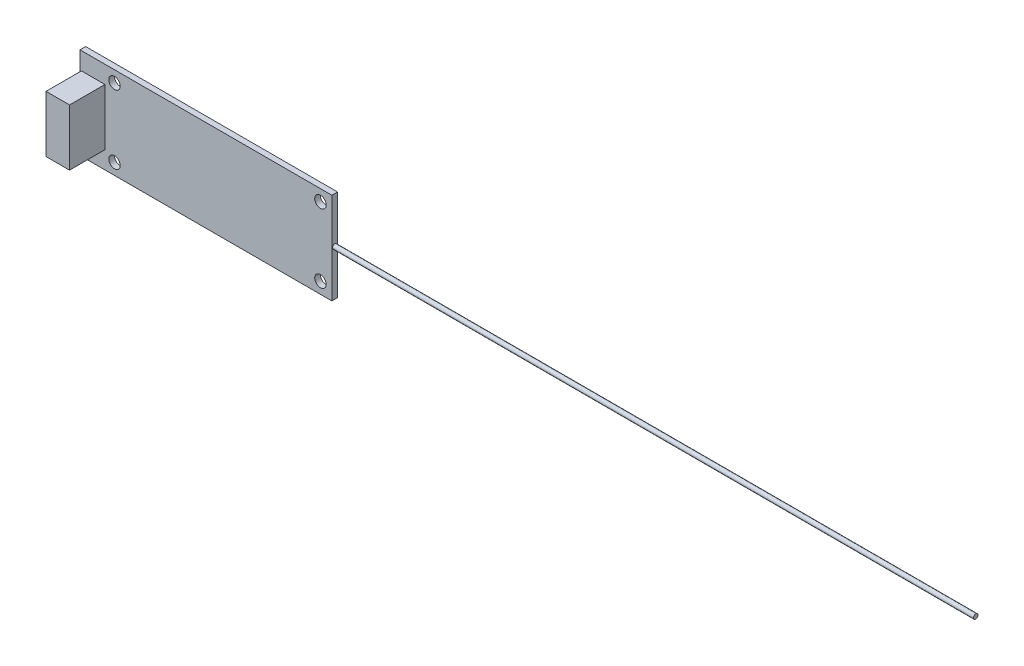
ISO-10303-21;
HEADER;
FILE_DESCRIPTION(('STEP AP214'),'2;1');
FILE_NAME('part.step','',(''),(''),'','','');
FILE_SCHEMA(('AUTOMOTIVE_DESIGN { 1 0 10303 214 1 1 1 1 }'));
ENDSEC;
DATA;
#1=APPLICATION_CONTEXT('core data for automotive mechanical design processes');
#2=APPLICATION_PROTOCOL_DEFINITION('international standard','automotive_design',2000,#1);
#3=PRODUCT_CONTEXT('',#1,'mechanical');
#4=PRODUCT('Part','Part','',(#3));
#5=PRODUCT_RELATED_PRODUCT_CATEGORY('part','',(#4));
#6=PRODUCT_DEFINITION_FORMATION('','',#4);
#7=PRODUCT_DEFINITION_CONTEXT('part definition',#1,'design');
#8=PRODUCT_DEFINITION('design','',#6,#7);
#9=PRODUCT_DEFINITION_SHAPE('','',#8);
#10=(LENGTH_UNIT() NAMED_UNIT(*) SI_UNIT(.MILLI.,.METRE.));
#11=(NAMED_UNIT(*) PLANE_ANGLE_UNIT() SI_UNIT($,.RADIAN.));
#12=(NAMED_UNIT(*) SI_UNIT($,.STERADIAN.) SOLID_ANGLE_UNIT());
#13=UNCERTAINTY_MEASURE_WITH_UNIT(LENGTH_MEASURE(1.E-05),#10,'distance_accuracy_value','');
#14=(GEOMETRIC_REPRESENTATION_CONTEXT(3) GLOBAL_UNCERTAINTY_ASSIGNED_CONTEXT((#13)) GLOBAL_UNIT_ASSIGNED_CONTEXT((#10,
#11,#12)) REPRESENTATION_CONTEXT('',''));
#15=CARTESIAN_POINT('',(0.,0.,0.));
#16=DIRECTION('',(0.,0.,1.));
#17=DIRECTION('',(1.,0.,0.));
#18=AXIS2_PLACEMENT_3D('',#15,#16,#17);
#19=CARTESIAN_POINT('',(34.925,12.7,1.5748));
#20=DIRECTION('',(0.,0.,-1.));
#21=DIRECTION('',(-1.,0.,0.));
#22=AXIS2_PLACEMENT_3D('',#19,#20,#21);
#23=PLANE('',#22);
#24=DIRECTION('',(0.,1.,0.));
#25=VECTOR('',#24,1.);
#26=CARTESIAN_POINT('',(34.925,-12.7,1.5748));
#27=LINE('',#26,#25);
#28=CARTESIAN_POINT('',(34.925,-12.7,1.5748));
#29=VERTEX_POINT('',#28);
#30=CARTESIAN_POINT('',(34.925,12.7,1.5748));
#31=VERTEX_POINT('',#30);
#32=EDGE_CURVE('E250',#29,#31,#27,.T.);
#33=ORIENTED_EDGE('',*,*,#32,.T.);
#34=DIRECTION('',(-1.,0.,0.));
#35=VECTOR('',#34,1.);
#36=CARTESIAN_POINT('',(-34.925,12.7,1.5748));
#37=LINE('',#36,#35);
#38=CARTESIAN_POINT('',(-34.925,12.7,1.5748));
#39=VERTEX_POINT('',#38);
#40=EDGE_CURVE('E253',#31,#39,#37,.T.);
#41=ORIENTED_EDGE('',*,*,#40,.T.);
#42=DIRECTION('',(0.,-1.,0.));
#43=VECTOR('',#42,1.);
#44=CARTESIAN_POINT('',(-34.925,-12.7,1.5748));
#45=LINE('',#44,#43);
#46=CARTESIAN_POINT('',(-34.925,-12.7,1.5748));
#47=VERTEX_POINT('',#46);
#48=EDGE_CURVE('E255',#39,#47,#45,.T.);
#49=ORIENTED_EDGE('',*,*,#48,.T.);
#50=DIRECTION('',(1.,0.,0.));
#51=VECTOR('',#50,1.);
#52=CARTESIAN_POINT('',(-34.925,-12.7,1.5748));
#53=LINE('',#52,#51);
#54=EDGE_CURVE('E210',#47,#29,#53,.T.);
#55=ORIENTED_EDGE('',*,*,#54,.T.);
#56=EDGE_LOOP('',(#33,#41,#49,#55));
#57=FACE_BOUND('',#56,.T.);
#58=CARTESIAN_POINT('',(31.75,9.525,1.5748));
#59=DIRECTION('',(0.,0.,1.));
#60=DIRECTION('',(1.,0.,0.));
#61=AXIS2_PLACEMENT_3D('',#58,#59,#60);
#62=CIRCLE('',#61,1.5875);
#63=CARTESIAN_POINT('',(33.3375,9.525,1.5748));
#64=VERTEX_POINT('',#63);
#65=EDGE_CURVE('E221',#64,#64,#62,.T.);
#66=ORIENTED_EDGE('',*,*,#65,.F.);
#67=EDGE_LOOP('',(#66));
#68=FACE_BOUND('',#67,.T.);
#69=CARTESIAN_POINT('',(-25.38222,9.525,1.5748));
#70=DIRECTION('',(0.,0.,1.));
#71=DIRECTION('',(1.,0.,0.));
#72=AXIS2_PLACEMENT_3D('',#69,#70,#71);
#73=CIRCLE('',#72,1.5875);
#74=CARTESIAN_POINT('',(-23.79472,9.525,1.5748));
#75=VERTEX_POINT('',#74);
#76=EDGE_CURVE('E222',#75,#75,#73,.T.);
#77=ORIENTED_EDGE('',*,*,#76,.F.);
#78=EDGE_LOOP('',(#77));
#79=FACE_BOUND('',#78,.T.);
#80=CARTESIAN_POINT('',(31.75,-9.525,1.5748));
#81=DIRECTION('',(0.,0.,1.));
#82=DIRECTION('',(1.,0.,0.));
#83=AXIS2_PLACEMENT_3D('',#80,#81,#82);
#84=CIRCLE('',#83,1.5875);
#85=CARTESIAN_POINT('',(33.3375,-9.525,1.5748));
#86=VERTEX_POINT('',#85);
#87=EDGE_CURVE('E226',#86,#86,#84,.T.);
#88=ORIENTED_EDGE('',*,*,#87,.F.);
#89=EDGE_LOOP('',(#88));
#90=FACE_BOUND('',#89,.T.);
#91=CARTESIAN_POINT('',(-25.38222,-9.525,1.5748));
#92=DIRECTION('',(0.,0.,1.));
#93=DIRECTION('',(1.,0.,0.));
#94=AXIS2_PLACEMENT_3D('',#91,#92,#93);
#95=CIRCLE('',#94,1.5875);
#96=CARTESIAN_POINT('',(-23.79472,-9.525,1.5748));
#97=VERTEX_POINT('',#96);
#98=EDGE_CURVE('E229',#97,#97,#95,.T.);
#99=ORIENTED_EDGE('',*,*,#98,.F.);
#100=EDGE_LOOP('',(#99));
#101=FACE_BOUND('',#100,.T.);
#102=DIRECTION('',(0.,1.,0.));
#103=VECTOR('',#102,1.);
#104=CARTESIAN_POINT('',(-28.0162,7.83589999999999,1.5748));
#105=LINE('',#104,#103);
#106=CARTESIAN_POINT('',(-28.0162,-7.8359,1.5748));
#107=VERTEX_POINT('',#106);
#108=CARTESIAN_POINT('',(-28.0162,7.83589999999999,1.5748));
#109=VERTEX_POINT('',#108);
#110=EDGE_CURVE('E150',#107,#109,#105,.T.);
#111=ORIENTED_EDGE('',*,*,#110,.F.);
#112=DIRECTION('',(1.,0.,0.));
#113=VECTOR('',#112,1.);
#114=CARTESIAN_POINT('',(-34.544,-7.8359,1.5748));
#115=LINE('',#114,#113);
#116=CARTESIAN_POINT('',(-34.544,-7.8359,1.5748));
#117=VERTEX_POINT('',#116);
#118=EDGE_CURVE('E147',#117,#107,#115,.T.);
#119=ORIENTED_EDGE('',*,*,#118,.F.);
#120=DIRECTION('',(0.,-1.,0.));
#121=VECTOR('',#120,1.);
#122=CARTESIAN_POINT('',(-34.544,7.83589999999999,1.5748));
#123=LINE('',#122,#121);
#124=CARTESIAN_POINT('',(-34.544,7.83589999999999,1.5748));
#125=VERTEX_POINT('',#124);
#126=EDGE_CURVE('E61',#125,#117,#123,.T.);
#127=ORIENTED_EDGE('',*,*,#126,.F.);
#128=DIRECTION('',(-1.,0.,0.));
#129=VECTOR('',#128,1.);
#130=CARTESIAN_POINT('',(-34.544,7.83589999999999,1.5748));
#131=LINE('',#130,#129);
#132=EDGE_CURVE('E56',#109,#125,#131,.T.);
#133=ORIENTED_EDGE('',*,*,#132,.F.);
#134=EDGE_LOOP('',(#111,#119,#127,#133));
#135=FACE_BOUND('',#134,.T.);
#136=ADVANCED_FACE('F39',(#57,#68,#79,#90,#101,#135),#23,.F.);
#137=CARTESIAN_POINT('',(34.925,-12.7,1.5748));
#138=DIRECTION('',(-1.,0.,0.));
#139=DIRECTION('',(0.,0.,1.));
#140=AXIS2_PLACEMENT_3D('',#137,#138,#139);
#141=PLANE('',#140);
#142=DIRECTION('',(0.,1.,0.));
#143=VECTOR('',#142,1.);
#144=CARTESIAN_POINT('',(34.925,-12.7,0.));
#145=LINE('',#144,#143);
#146=CARTESIAN_POINT('',(34.925,-12.7,0.));
#147=VERTEX_POINT('',#146);
#148=CARTESIAN_POINT('',(34.925,12.7,0.));
#149=VERTEX_POINT('',#148);
#150=EDGE_CURVE('E249',#147,#149,#145,.T.);
#151=ORIENTED_EDGE('',*,*,#150,.T.);
#152=DIRECTION('',(0.,0.,-1.));
#153=VECTOR('',#152,1.);
#154=CARTESIAN_POINT('',(34.925,12.7,1.5748));
#155=LINE('',#154,#153);
#156=EDGE_CURVE('E48',#31,#149,#155,.T.);
#157=ORIENTED_EDGE('',*,*,#156,.F.);
#158=ORIENTED_EDGE('',*,*,#32,.F.);
#159=DIRECTION('',(0.,0.,-1.));
#160=VECTOR('',#159,1.);
#161=CARTESIAN_POINT('',(34.925,-12.7,1.5748));
#162=LINE('',#161,#160);
#163=EDGE_CURVE('E205',#29,#147,#162,.T.);
#164=ORIENTED_EDGE('',*,*,#163,.T.);
#165=EDGE_LOOP('',(#151,#157,#158,#164));
#166=FACE_BOUND('',#165,.T.);
#167=CARTESIAN_POINT('',(34.925,0.,0.772028936154356));
#168=DIRECTION('',(-1.,0.,0.));
#169=DIRECTION('',(0.,0.,1.));
#170=AXIS2_PLACEMENT_3D('',#167,#168,#169);
#171=CIRCLE('',#170,0.635);
#172=CARTESIAN_POINT('',(34.925,0.,1.40702893615436));
#173=VERTEX_POINT('',#172);
#174=EDGE_CURVE('E11',#173,#173,#171,.F.);
#175=ORIENTED_EDGE('',*,*,#174,.F.);
#176=EDGE_LOOP('',(#175));
#177=FACE_BOUND('',#176,.T.);
#178=ADVANCED_FACE('F41',(#166,#177),#141,.F.);
#179=CARTESIAN_POINT('',(-34.925,12.7,1.5748));
#180=DIRECTION('',(0.,-1.,0.));
#181=DIRECTION('',(0.,0.,-1.));
#182=AXIS2_PLACEMENT_3D('',#179,#180,#181);
#183=PLANE('',#182);
#184=DIRECTION('',(-1.,0.,0.));
#185=VECTOR('',#184,1.);
#186=CARTESIAN_POINT('',(-34.925,12.7,0.));
#187=LINE('',#186,#185);
#188=CARTESIAN_POINT('',(-34.925,12.7,0.));
#189=VERTEX_POINT('',#188);
#190=EDGE_CURVE('E259',#149,#189,#187,.T.);
#191=ORIENTED_EDGE('',*,*,#190,.T.);
#192=DIRECTION('',(0.,0.,-1.));
#193=VECTOR('',#192,1.);
#194=CARTESIAN_POINT('',(-34.925,12.7,1.5748));
#195=LINE('',#194,#193);
#196=EDGE_CURVE('E213',#39,#189,#195,.T.);
#197=ORIENTED_EDGE('',*,*,#196,.F.);
#198=ORIENTED_EDGE('',*,*,#40,.F.);
#199=ORIENTED_EDGE('',*,*,#156,.T.);
#200=EDGE_LOOP('',(#191,#197,#198,#199));
#201=FACE_BOUND('',#200,.T.);
#202=ADVANCED_FACE('F293',(#201),#183,.F.);
#203=CARTESIAN_POINT('',(-34.925,-12.7,1.5748));
#204=DIRECTION('',(1.,0.,0.));
#205=DIRECTION('',(0.,0.,-1.));
#206=AXIS2_PLACEMENT_3D('',#203,#204,#205);
#207=PLANE('',#206);
#208=DIRECTION('',(0.,-1.,0.));
#209=VECTOR('',#208,1.);
#210=CARTESIAN_POINT('',(-34.925,-12.7,0.));
#211=LINE('',#210,#209);
#212=CARTESIAN_POINT('',(-34.925,-12.7,0.));
#213=VERTEX_POINT('',#212);
#214=EDGE_CURVE('E200',#189,#213,#211,.T.);
#215=ORIENTED_EDGE('',*,*,#214,.T.);
#216=DIRECTION('',(0.,0.,-1.));
#217=VECTOR('',#216,1.);
#218=CARTESIAN_POINT('',(-34.925,-12.7,1.5748));
#219=LINE('',#218,#217);
#220=EDGE_CURVE('E209',#47,#213,#219,.T.);
#221=ORIENTED_EDGE('',*,*,#220,.F.);
#222=ORIENTED_EDGE('',*,*,#48,.F.);
#223=ORIENTED_EDGE('',*,*,#196,.T.);
#224=EDGE_LOOP('',(#215,#221,#222,#223));
#225=FACE_BOUND('',#224,.T.);
#226=ADVANCED_FACE('F265',(#225),#207,.F.);
#227=CARTESIAN_POINT('',(-34.925,-12.7,1.5748));
#228=DIRECTION('',(0.,1.,0.));
#229=DIRECTION('',(0.,0.,1.));
#230=AXIS2_PLACEMENT_3D('',#227,#228,#229);
#231=PLANE('',#230);
#232=DIRECTION('',(1.,0.,0.));
#233=VECTOR('',#232,1.);
#234=CARTESIAN_POINT('',(-34.925,-12.7,0.));
#235=LINE('',#234,#233);
#236=CARTESIAN_POINT('',(-17.1360662289999,-12.7,0.));
#237=VERTEX_POINT('',#236);
#238=EDGE_CURVE('E199',#213,#237,#235,.T.);
#239=ORIENTED_EDGE('',*,*,#238,.T.);
#240=DIRECTION('',(0.,0.,1.));
#241=VECTOR('',#240,1.);
#242=CARTESIAN_POINT('',(-17.1360662289999,-12.7,-4.1402));
#243=LINE('',#242,#241);
#244=CARTESIAN_POINT('',(-17.1360662289999,-12.7,-4.1402));
#245=VERTEX_POINT('',#244);
#246=EDGE_CURVE('E170',#245,#237,#243,.T.);
#247=ORIENTED_EDGE('',*,*,#246,.F.);
#248=DIRECTION('',(-1.,0.,0.));
#249=VECTOR('',#248,1.);
#250=CARTESIAN_POINT('',(-17.1360662289999,-12.7,-4.1402));
#251=LINE('',#250,#249);
#252=CARTESIAN_POINT('',(-9.00806622899988,-12.7,-4.1402));
#253=VERTEX_POINT('',#252);
#254=EDGE_CURVE('E168',#253,#245,#251,.T.);
#255=ORIENTED_EDGE('',*,*,#254,.F.);
#256=DIRECTION('',(0.,0.,1.));
#257=VECTOR('',#256,1.);
#258=CARTESIAN_POINT('',(-9.00806622899988,-12.7,-4.1402));
#259=LINE('',#258,#257);
#260=CARTESIAN_POINT('',(-9.00806622899988,-12.7,0.));
#261=VERTEX_POINT('',#260);
#262=EDGE_CURVE('E182',#253,#261,#259,.T.);
#263=ORIENTED_EDGE('',*,*,#262,.T.);
#264=EDGE_CURVE('E196',#261,#147,#235,.T.);
#265=ORIENTED_EDGE('',*,*,#264,.T.);
#266=ORIENTED_EDGE('',*,*,#163,.F.);
#267=ORIENTED_EDGE('',*,*,#54,.F.);
#268=ORIENTED_EDGE('',*,*,#220,.T.);
#269=EDGE_LOOP('',(#239,#247,#255,#263,#265,#266,#267,#268));
#270=FACE_BOUND('',#269,.T.);
#271=ADVANCED_FACE('F271',(#270),#231,.F.);
#272=CARTESIAN_POINT('',(34.925,12.7,0.));
#273=DIRECTION('',(0.,0.,-1.));
#274=DIRECTION('',(-1.,0.,0.));
#275=AXIS2_PLACEMENT_3D('',#272,#273,#274);
#276=PLANE('',#275);
#277=DIRECTION('',(0.,1.,0.));
#278=VECTOR('',#277,1.);
#279=CARTESIAN_POINT('',(-17.1360662289999,-12.7,0.));
#280=LINE('',#279,#278);
#281=CARTESIAN_POINT('',(-17.1360662289999,-3.9624,0.));
#282=VERTEX_POINT('',#281);
#283=EDGE_CURVE('E151',#237,#282,#280,.T.);
#284=ORIENTED_EDGE('',*,*,#283,.F.);
#285=ORIENTED_EDGE('',*,*,#238,.F.);
#286=ORIENTED_EDGE('',*,*,#214,.F.);
#287=ORIENTED_EDGE('',*,*,#190,.F.);
#288=ORIENTED_EDGE('',*,*,#150,.F.);
#289=ORIENTED_EDGE('',*,*,#264,.F.);
#290=DIRECTION('',(0.,-1.,0.));
#291=VECTOR('',#290,1.);
#292=CARTESIAN_POINT('',(-9.00806622899988,-12.7,0.));
#293=LINE('',#292,#291);
#294=CARTESIAN_POINT('',(-9.00806622899988,-3.9624,0.));
#295=VERTEX_POINT('',#294);
#296=EDGE_CURVE('E164',#295,#261,#293,.T.);
#297=ORIENTED_EDGE('',*,*,#296,.F.);
#298=DIRECTION('',(1.,0.,0.));
#299=VECTOR('',#298,1.);
#300=CARTESIAN_POINT('',(-17.1360662289999,-3.9624,0.));
#301=LINE('',#300,#299);
#302=EDGE_CURVE('E154',#282,#295,#301,.T.);
#303=ORIENTED_EDGE('',*,*,#302,.F.);
#304=EDGE_LOOP('',(#284,#285,#286,#287,#288,#289,#297,#303));
#305=FACE_BOUND('',#304,.T.);
#306=CARTESIAN_POINT('',(-25.38222,-9.525,0.));
#307=DIRECTION('',(0.,0.,-1.));
#308=DIRECTION('',(-1.,0.,0.));
#309=AXIS2_PLACEMENT_3D('',#306,#307,#308);
#310=CIRCLE('',#309,1.5875);
#311=CARTESIAN_POINT('',(-26.96972,-9.525,0.));
#312=VERTEX_POINT('',#311);
#313=EDGE_CURVE('E227',#312,#312,#310,.T.);
#314=ORIENTED_EDGE('',*,*,#313,.F.);
#315=EDGE_LOOP('',(#314));
#316=FACE_BOUND('',#315,.T.);
#317=CARTESIAN_POINT('',(31.75,-9.525,0.));
#318=DIRECTION('',(0.,0.,-1.));
#319=DIRECTION('',(-1.,0.,0.));
#320=AXIS2_PLACEMENT_3D('',#317,#318,#319);
#321=CIRCLE('',#320,1.5875);
#322=CARTESIAN_POINT('',(30.1625,-9.525,0.));
#323=VERTEX_POINT('',#322);
#324=EDGE_CURVE('E223',#323,#323,#321,.T.);
#325=ORIENTED_EDGE('',*,*,#324,.F.);
#326=EDGE_LOOP('',(#325));
#327=FACE_BOUND('',#326,.T.);
#328=CARTESIAN_POINT('',(-25.38222,9.525,0.));
#329=DIRECTION('',(0.,0.,-1.));
#330=DIRECTION('',(-1.,0.,0.));
#331=AXIS2_PLACEMENT_3D('',#328,#329,#330);
#332=CIRCLE('',#331,1.5875);
#333=CARTESIAN_POINT('',(-26.96972,9.525,0.));
#334=VERTEX_POINT('',#333);
#335=EDGE_CURVE('E218',#334,#334,#332,.T.);
#336=ORIENTED_EDGE('',*,*,#335,.F.);
#337=EDGE_LOOP('',(#336));
#338=FACE_BOUND('',#337,.T.);
#339=CARTESIAN_POINT('',(31.75,9.525,0.));
#340=DIRECTION('',(0.,0.,-1.));
#341=DIRECTION('',(-1.,0.,0.));
#342=AXIS2_PLACEMENT_3D('',#339,#340,#341);
#343=CIRCLE('',#342,1.5875);
#344=CARTESIAN_POINT('',(30.1625,9.525,0.));
#345=VERTEX_POINT('',#344);
#346=EDGE_CURVE('E246',#345,#345,#343,.T.);
#347=ORIENTED_EDGE('',*,*,#346,.F.);
#348=EDGE_LOOP('',(#347));
#349=FACE_BOUND('',#348,.T.);
#350=ADVANCED_FACE('F273',(#305,#316,#327,#338,#349),#276,.T.);
#351=CARTESIAN_POINT('',(31.75,9.525,1.5748));
#352=DIRECTION('',(0.,0.,1.));
#353=DIRECTION('',(1.,0.,0.));
#354=AXIS2_PLACEMENT_3D('',#351,#352,#353);
#355=CYLINDRICAL_SURFACE('',#354,1.5875);
#356=ORIENTED_EDGE('',*,*,#346,.T.);
#357=EDGE_LOOP('',(#356));
#358=FACE_BOUND('',#357,.T.);
#359=ORIENTED_EDGE('',*,*,#65,.T.);
#360=EDGE_LOOP('',(#359));
#361=FACE_BOUND('',#360,.T.);
#362=ADVANCED_FACE('F308',(#358,#361),#355,.F.);
#363=CARTESIAN_POINT('',(-25.38222,9.525,1.5748));
#364=DIRECTION('',(0.,0.,1.));
#365=DIRECTION('',(1.,0.,0.));
#366=AXIS2_PLACEMENT_3D('',#363,#364,#365);
#367=CYLINDRICAL_SURFACE('',#366,1.5875);
#368=ORIENTED_EDGE('',*,*,#335,.T.);
#369=EDGE_LOOP('',(#368));
#370=FACE_BOUND('',#369,.T.);
#371=ORIENTED_EDGE('',*,*,#76,.T.);
#372=EDGE_LOOP('',(#371));
#373=FACE_BOUND('',#372,.T.);
#374=ADVANCED_FACE('F329',(#370,#373),#367,.F.);
#375=CARTESIAN_POINT('',(31.75,-9.525,1.5748));
#376=DIRECTION('',(0.,0.,1.));
#377=DIRECTION('',(1.,0.,0.));
#378=AXIS2_PLACEMENT_3D('',#375,#376,#377);
#379=CYLINDRICAL_SURFACE('',#378,1.5875);
#380=ORIENTED_EDGE('',*,*,#324,.T.);
#381=EDGE_LOOP('',(#380));
#382=FACE_BOUND('',#381,.T.);
#383=ORIENTED_EDGE('',*,*,#87,.T.);
#384=EDGE_LOOP('',(#383));
#385=FACE_BOUND('',#384,.T.);
#386=ADVANCED_FACE('F336',(#382,#385),#379,.F.);
#387=CARTESIAN_POINT('',(-25.38222,-9.525,1.5748));
#388=DIRECTION('',(0.,0.,1.));
#389=DIRECTION('',(1.,0.,0.));
#390=AXIS2_PLACEMENT_3D('',#387,#388,#389);
#391=CYLINDRICAL_SURFACE('',#390,1.5875);
#392=ORIENTED_EDGE('',*,*,#313,.T.);
#393=EDGE_LOOP('',(#392));
#394=FACE_BOUND('',#393,.T.);
#395=ORIENTED_EDGE('',*,*,#98,.T.);
#396=EDGE_LOOP('',(#395));
#397=FACE_BOUND('',#396,.T.);
#398=ADVANCED_FACE('F343',(#394,#397),#391,.F.);
#399=CARTESIAN_POINT('',(212.725,0.,0.772028936154356));
#400=DIRECTION('',(-1.,0.,0.));
#401=DIRECTION('',(0.,0.,1.));
#402=AXIS2_PLACEMENT_3D('',#399,#400,#401);
#403=CYLINDRICAL_SURFACE('',#402,0.635);
#404=CARTESIAN_POINT('',(212.725,0.,0.772028936154356));
#405=DIRECTION('',(1.,0.,0.));
#406=DIRECTION('',(0.,0.,-1.));
#407=AXIS2_PLACEMENT_3D('',#404,#405,#406);
#408=CIRCLE('',#407,0.635);
#409=CARTESIAN_POINT('',(212.725,0.,0.137028936154356));
#410=VERTEX_POINT('',#409);
#411=EDGE_CURVE('E235',#410,#410,#408,.T.);
#412=ORIENTED_EDGE('',*,*,#411,.F.);
#413=EDGE_LOOP('',(#412));
#414=FACE_BOUND('',#413,.T.);
#415=ORIENTED_EDGE('',*,*,#174,.T.);
#416=EDGE_LOOP('',(#415));
#417=FACE_BOUND('',#416,.T.);
#418=ADVANCED_FACE('F351',(#414,#417),#403,.T.);
#419=CARTESIAN_POINT('',(212.725,0.,0.772028936154356));
#420=DIRECTION('',(1.,0.,0.));
#421=DIRECTION('',(0.,0.,-1.));
#422=AXIS2_PLACEMENT_3D('',#419,#420,#421);
#423=PLANE('',#422);
#424=ORIENTED_EDGE('',*,*,#411,.T.);
#425=EDGE_LOOP('',(#424));
#426=FACE_BOUND('',#425,.T.);
#427=ADVANCED_FACE('F359',(#426),#423,.T.);
#428=CARTESIAN_POINT('',(-17.1360662289999,-12.7,-4.1402));
#429=DIRECTION('',(1.,0.,0.));
#430=DIRECTION('',(0.,0.,-1.));
#431=AXIS2_PLACEMENT_3D('',#428,#429,#430);
#432=PLANE('',#431);
#433=ORIENTED_EDGE('',*,*,#283,.T.);
#434=DIRECTION('',(0.,0.,1.));
#435=VECTOR('',#434,1.);
#436=CARTESIAN_POINT('',(-17.1360662289999,-3.9624,-4.1402));
#437=LINE('',#436,#435);
#438=CARTESIAN_POINT('',(-17.1360662289999,-3.9624,-4.1402));
#439=VERTEX_POINT('',#438);
#440=EDGE_CURVE('E188',#439,#282,#437,.T.);
#441=ORIENTED_EDGE('',*,*,#440,.F.);
#442=DIRECTION('',(0.,1.,0.));
#443=VECTOR('',#442,1.);
#444=CARTESIAN_POINT('',(-17.1360662289999,-12.7,-4.1402));
#445=LINE('',#444,#443);
#446=EDGE_CURVE('E160',#245,#439,#445,.T.);
#447=ORIENTED_EDGE('',*,*,#446,.F.);
#448=ORIENTED_EDGE('',*,*,#246,.T.);
#449=EDGE_LOOP('',(#433,#441,#447,#448));
#450=FACE_BOUND('',#449,.T.);
#451=ADVANCED_FACE('F277',(#450),#432,.F.);
#452=CARTESIAN_POINT('',(-17.1360662289999,-3.9624,-4.1402));
#453=DIRECTION('',(0.,-1.,0.));
#454=DIRECTION('',(1.,0.,0.));
#455=AXIS2_PLACEMENT_3D('',#452,#453,#454);
#456=PLANE('',#455);
#457=ORIENTED_EDGE('',*,*,#302,.T.);
#458=DIRECTION('',(0.,0.,1.));
#459=VECTOR('',#458,1.);
#460=CARTESIAN_POINT('',(-9.00806622899988,-3.9624,-4.1402));
#461=LINE('',#460,#459);
#462=CARTESIAN_POINT('',(-9.00806622899988,-3.9624,-4.1402));
#463=VERTEX_POINT('',#462);
#464=EDGE_CURVE('E175',#463,#295,#461,.T.);
#465=ORIENTED_EDGE('',*,*,#464,.F.);
#466=DIRECTION('',(1.,0.,0.));
#467=VECTOR('',#466,1.);
#468=CARTESIAN_POINT('',(-17.1360662289999,-3.9624,-4.1402));
#469=LINE('',#468,#467);
#470=EDGE_CURVE('E163',#439,#463,#469,.T.);
#471=ORIENTED_EDGE('',*,*,#470,.F.);
#472=ORIENTED_EDGE('',*,*,#440,.T.);
#473=EDGE_LOOP('',(#457,#465,#471,#472));
#474=FACE_BOUND('',#473,.T.);
#475=ADVANCED_FACE('F279',(#474),#456,.F.);
#476=CARTESIAN_POINT('',(-9.00806622899988,-12.7,-4.1402));
#477=DIRECTION('',(-1.,0.,0.));
#478=DIRECTION('',(0.,0.,1.));
#479=AXIS2_PLACEMENT_3D('',#476,#477,#478);
#480=PLANE('',#479);
#481=ORIENTED_EDGE('',*,*,#296,.T.);
#482=ORIENTED_EDGE('',*,*,#262,.F.);
#483=DIRECTION('',(0.,-1.,0.));
#484=VECTOR('',#483,1.);
#485=CARTESIAN_POINT('',(-9.00806622899988,-12.7,-4.1402));
#486=LINE('',#485,#484);
#487=EDGE_CURVE('E166',#463,#253,#486,.T.);
#488=ORIENTED_EDGE('',*,*,#487,.F.);
#489=ORIENTED_EDGE('',*,*,#464,.T.);
#490=EDGE_LOOP('',(#481,#482,#488,#489));
#491=FACE_BOUND('',#490,.T.);
#492=ADVANCED_FACE('F285',(#491),#480,.F.);
#493=CARTESIAN_POINT('',(0.,0.,-4.1402));
#494=DIRECTION('',(0.,0.,-1.));
#495=DIRECTION('',(-1.,0.,0.));
#496=AXIS2_PLACEMENT_3D('',#493,#494,#495);
#497=PLANE('',#496);
#498=ORIENTED_EDGE('',*,*,#446,.T.);
#499=ORIENTED_EDGE('',*,*,#470,.T.);
#500=ORIENTED_EDGE('',*,*,#487,.T.);
#501=ORIENTED_EDGE('',*,*,#254,.T.);
#502=EDGE_LOOP('',(#498,#499,#500,#501));
#503=FACE_BOUND('',#502,.T.);
#504=ADVANCED_FACE('F283',(#503),#497,.T.);
#505=CARTESIAN_POINT('',(-28.0162,7.83589999999999,11.4046));
#506=DIRECTION('',(-1.,0.,0.));
#507=DIRECTION('',(0.,-1.,0.));
#508=AXIS2_PLACEMENT_3D('',#505,#506,#507);
#509=PLANE('',#508);
#510=ORIENTED_EDGE('',*,*,#110,.T.);
#511=DIRECTION('',(0.,0.,-1.));
#512=VECTOR('',#511,1.);
#513=CARTESIAN_POINT('',(-28.0162,7.83589999999999,11.4046));
#514=LINE('',#513,#512);
#515=CARTESIAN_POINT('',(-28.0162,7.83589999999999,11.4046));
#516=VERTEX_POINT('',#515);
#517=EDGE_CURVE('E131',#516,#109,#514,.T.);
#518=ORIENTED_EDGE('',*,*,#517,.F.);
#519=DIRECTION('',(0.,1.,0.));
#520=VECTOR('',#519,1.);
#521=CARTESIAN_POINT('',(-28.0162,7.83589999999999,11.4046));
#522=LINE('',#521,#520);
#523=CARTESIAN_POINT('',(-28.0162,-7.8359,11.4046));
#524=VERTEX_POINT('',#523);
#525=EDGE_CURVE('E138',#524,#516,#522,.T.);
#526=ORIENTED_EDGE('',*,*,#525,.F.);
#527=DIRECTION('',(0.,0.,-1.));
#528=VECTOR('',#527,1.);
#529=CARTESIAN_POINT('',(-28.0162,-7.8359,11.4046));
#530=LINE('',#529,#528);
#531=EDGE_CURVE('E440',#524,#107,#530,.T.);
#532=ORIENTED_EDGE('',*,*,#531,.T.);
#533=EDGE_LOOP('',(#510,#518,#526,#532));
#534=FACE_BOUND('',#533,.T.);
#535=ADVANCED_FACE('F149',(#534),#509,.F.);
#536=CARTESIAN_POINT('',(-34.544,7.83589999999999,11.4046));
#537=DIRECTION('',(0.,-1.,0.));
#538=DIRECTION('',(0.,0.,-1.));
#539=AXIS2_PLACEMENT_3D('',#536,#537,#538);
#540=PLANE('',#539);
#541=ORIENTED_EDGE('',*,*,#132,.T.);
#542=DIRECTION('',(0.,0.,-1.));
#543=VECTOR('',#542,1.);
#544=CARTESIAN_POINT('',(-34.544,7.83589999999999,11.4046));
#545=LINE('',#544,#543);
#546=CARTESIAN_POINT('',(-34.544,7.83589999999999,11.4046));
#547=VERTEX_POINT('',#546);
#548=EDGE_CURVE('E134',#547,#125,#545,.T.);
#549=ORIENTED_EDGE('',*,*,#548,.F.);
#550=DIRECTION('',(-1.,0.,0.));
#551=VECTOR('',#550,1.);
#552=CARTESIAN_POINT('',(-34.544,7.83589999999999,11.4046));
#553=LINE('',#552,#551);
#554=EDGE_CURVE('E127',#516,#547,#553,.T.);
#555=ORIENTED_EDGE('',*,*,#554,.F.);
#556=ORIENTED_EDGE('',*,*,#517,.T.);
#557=EDGE_LOOP('',(#541,#549,#555,#556));
#558=FACE_BOUND('',#557,.T.);
#559=ADVANCED_FACE('F129',(#558),#540,.F.);
#560=CARTESIAN_POINT('',(-34.544,7.83589999999999,11.4046));
#561=DIRECTION('',(1.,0.,0.));
#562=DIRECTION('',(0.,0.,-1.));
#563=AXIS2_PLACEMENT_3D('',#560,#561,#562);
#564=PLANE('',#563);
#565=ORIENTED_EDGE('',*,*,#126,.T.);
#566=DIRECTION('',(0.,0.,-1.));
#567=VECTOR('',#566,1.);
#568=CARTESIAN_POINT('',(-34.544,-7.8359,11.4046));
#569=LINE('',#568,#567);
#570=CARTESIAN_POINT('',(-34.544,-7.8359,11.4046));
#571=VERTEX_POINT('',#570);
#572=EDGE_CURVE('E156',#571,#117,#569,.T.);
#573=ORIENTED_EDGE('',*,*,#572,.F.);
#574=DIRECTION('',(0.,-1.,0.));
#575=VECTOR('',#574,1.);
#576=CARTESIAN_POINT('',(-34.544,7.83589999999999,11.4046));
#577=LINE('',#576,#575);
#578=EDGE_CURVE('E137',#547,#571,#577,.T.);
#579=ORIENTED_EDGE('',*,*,#578,.F.);
#580=ORIENTED_EDGE('',*,*,#548,.T.);
#581=EDGE_LOOP('',(#565,#573,#579,#580));
#582=FACE_BOUND('',#581,.T.);
#583=ADVANCED_FACE('F404',(#582),#564,.F.);
#584=CARTESIAN_POINT('',(-34.544,-7.8359,11.4046));
#585=DIRECTION('',(0.,1.,0.));
#586=DIRECTION('',(0.,0.,1.));
#587=AXIS2_PLACEMENT_3D('',#584,#585,#586);
#588=PLANE('',#587);
#589=ORIENTED_EDGE('',*,*,#118,.T.);
#590=ORIENTED_EDGE('',*,*,#531,.F.);
#591=DIRECTION('',(1.,0.,0.));
#592=VECTOR('',#591,1.);
#593=CARTESIAN_POINT('',(-34.544,-7.8359,11.4046));
#594=LINE('',#593,#592);
#595=EDGE_CURVE('E143',#571,#524,#594,.T.);
#596=ORIENTED_EDGE('',*,*,#595,.F.);
#597=ORIENTED_EDGE('',*,*,#572,.T.);
#598=EDGE_LOOP('',(#589,#590,#596,#597));
#599=FACE_BOUND('',#598,.T.);
#600=ADVANCED_FACE('F411',(#599),#588,.F.);
#601=CARTESIAN_POINT('',(0.,0.,11.4046));
#602=DIRECTION('',(0.,0.,1.));
#603=DIRECTION('',(1.,0.,0.));
#604=AXIS2_PLACEMENT_3D('',#601,#602,#603);
#605=PLANE('',#604);
#606=ORIENTED_EDGE('',*,*,#525,.T.);
#607=ORIENTED_EDGE('',*,*,#554,.T.);
#608=ORIENTED_EDGE('',*,*,#578,.T.);
#609=ORIENTED_EDGE('',*,*,#595,.T.);
#610=EDGE_LOOP('',(#606,#607,#608,#609));
#611=FACE_BOUND('',#610,.T.);
#612=ADVANCED_FACE('F141',(#611),#605,.T.);
#613=CLOSED_SHELL('',(#136,#178,#202,#226,#271,#350,#362,#374,#386,#398,#418,#427,#451,#475,
#492,#504,#535,#559,#583,#600,#612));
#614=MANIFOLD_SOLID_BREP('B2',#613);
#615=ADVANCED_BREP_SHAPE_REPRESENTATION('',(#18,#614),#14);
#616=SHAPE_DEFINITION_REPRESENTATION(#9,#615);
ENDSEC;
END-ISO-10303-21;
